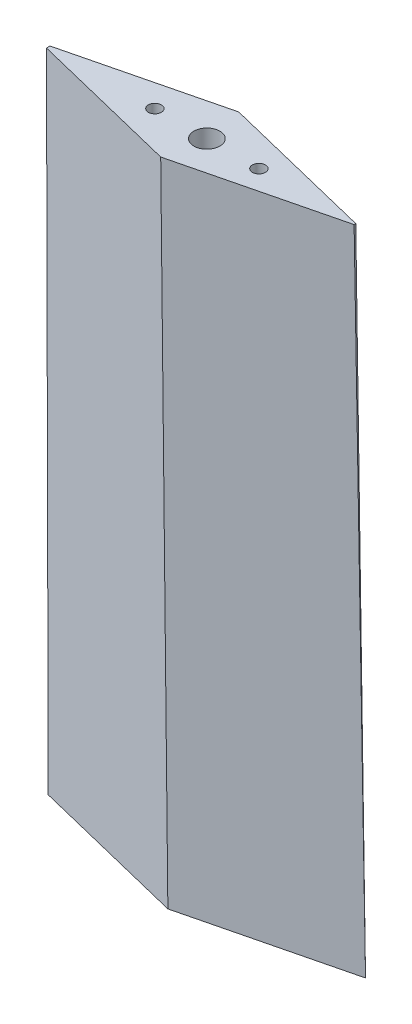
ISO-10303-21;
HEADER;
FILE_DESCRIPTION(('STEP AP214'),'2;1');
FILE_NAME('part.step','',(''),(''),'','','');
FILE_SCHEMA(('AUTOMOTIVE_DESIGN { 1 0 10303 214 1 1 1 1 }'));
ENDSEC;
DATA;
#1=APPLICATION_CONTEXT('core data for automotive mechanical design processes');
#2=APPLICATION_PROTOCOL_DEFINITION('international standard','automotive_design',2000,#1);
#3=PRODUCT_CONTEXT('',#1,'mechanical');
#4=PRODUCT('Part','Part','',(#3));
#5=PRODUCT_RELATED_PRODUCT_CATEGORY('part','',(#4));
#6=PRODUCT_DEFINITION_FORMATION('','',#4);
#7=PRODUCT_DEFINITION_CONTEXT('part definition',#1,'design');
#8=PRODUCT_DEFINITION('design','',#6,#7);
#9=PRODUCT_DEFINITION_SHAPE('','',#8);
#10=(LENGTH_UNIT() NAMED_UNIT(*) SI_UNIT(.MILLI.,.METRE.));
#11=(NAMED_UNIT(*) PLANE_ANGLE_UNIT() SI_UNIT($,.RADIAN.));
#12=(NAMED_UNIT(*) SI_UNIT($,.STERADIAN.) SOLID_ANGLE_UNIT());
#13=UNCERTAINTY_MEASURE_WITH_UNIT(LENGTH_MEASURE(1.E-05),#10,'distance_accuracy_value','');
#14=(GEOMETRIC_REPRESENTATION_CONTEXT(3) GLOBAL_UNCERTAINTY_ASSIGNED_CONTEXT((#13)) GLOBAL_UNIT_ASSIGNED_CONTEXT((#10,
#11,#12)) REPRESENTATION_CONTEXT('',''));
#15=CARTESIAN_POINT('',(0.,0.,0.));
#16=DIRECTION('',(0.,0.,1.));
#17=DIRECTION('',(1.,0.,0.));
#18=AXIS2_PLACEMENT_3D('',#15,#16,#17);
#19=CARTESIAN_POINT('',(134.681996719391,219.836565958458,-9.525));
#20=DIRECTION('',(0.999866416510167,0.0163446974617832,0.));
#21=DIRECTION('',(-0.0163446974617832,0.999866416510167,0.));
#22=AXIS2_PLACEMENT_3D('',#19,#20,#21);
#23=PLANE('',#22);
#24=DIRECTION('',(0.,0.,-1.));
#25=VECTOR('',#24,1.);
#26=CARTESIAN_POINT('',(132.097385652102,377.946914098348,-9.525));
#27=LINE('',#26,#25);
#28=CARTESIAN_POINT('',(132.097385652102,377.946914098348,0.205716307486944));
#29=VERTEX_POINT('',#28);
#30=CARTESIAN_POINT('',(132.097385652102,377.946914098348,-0.20571630748695));
#31=VERTEX_POINT('',#30);
#32=EDGE_CURVE('E49',#29,#31,#27,.T.);
#33=ORIENTED_EDGE('',*,*,#32,.F.);
#34=DIRECTION('',(-0.0163446836309879,0.999865570428571,0.00130091834944232));
#35=VECTOR('',#34,1.);
#36=CARTESIAN_POINT('',(134.682199250408,219.824176376929,-1.61200009608092E-05));
#37=LINE('',#36,#35);
#38=CARTESIAN_POINT('',(134.681996719391,219.836565958458,0.));
#39=VERTEX_POINT('',#38);
#40=EDGE_CURVE('E11',#39,#29,#37,.T.);
#41=ORIENTED_EDGE('',*,*,#40,.F.);
#42=DIRECTION('',(0.0163446836309879,-0.999865570428571,0.00130091834944232));
#43=VECTOR('',#42,1.);
#44=CARTESIAN_POINT('',(134.681794188375,219.848955539986,-1.61200009590745E-05));
#45=LINE('',#44,#43);
#46=EDGE_CURVE('E56',#31,#39,#45,.T.);
#47=ORIENTED_EDGE('',*,*,#46,.F.);
#48=EDGE_LOOP('',(#33,#41,#47));
#49=FACE_BOUND('',#48,.T.);
#50=ADVANCED_FACE('F33',(#49),#23,.T.);
#51=CARTESIAN_POINT('',(49.2246430956603,942.792954579603,0.));
#52=DIRECTION('',(0.238804060374286,0.00264025652948276,0.971064184178478));
#53=DIRECTION('',(0.971067568818316,0.,-0.238804892724763));
#54=AXIS2_PLACEMENT_3D('',#51,#52,#53);
#55=PLANE('',#54);
#56=DIRECTION('',(0.,0.999996303727557,-0.00271892096670104));
#57=VECTOR('',#56,1.);
#58=CARTESIAN_POINT('',(57.2177665065291,807.125541731836,-1.59679821194385));
#59=LINE('',#58,#57);
#60=CARTESIAN_POINT('',(57.2177665065291,219.836565958458,0.));
#61=VERTEX_POINT('',#60);
#62=CARTESIAN_POINT('',(57.2177665065291,377.946914098348,-0.429891129604688));
#63=VERTEX_POINT('',#62);
#64=EDGE_CURVE('E108',#61,#63,#59,.T.);
#65=ORIENTED_EDGE('',*,*,#64,.T.);
#66=DIRECTION('',(0.971067568818316,0.,-0.238804892724763));
#67=VECTOR('',#66,1.);
#68=CARTESIAN_POINT('',(49.5807832547215,377.946914098348,1.4481954472213));
#69=LINE('',#68,#67);
#70=CARTESIAN_POINT('',(94.2017878895919,377.946914098348,-9.52500000000005));
#71=VERTEX_POINT('',#70);
#72=EDGE_CURVE('E123',#63,#71,#69,.T.);
#73=ORIENTED_EDGE('',*,*,#72,.T.);
#74=DIRECTION('',(0.0110554869516549,-0.999938886236685,0.));
#75=VECTOR('',#74,1.);
#76=CARTESIAN_POINT('',(87.9567582020914,942.792954579603,-9.525));
#77=LINE('',#76,#75);
#78=CARTESIAN_POINT('',(95.9498816129603,219.836565958458,-9.525));
#79=VERTEX_POINT('',#78);
#80=EDGE_CURVE('E112',#71,#79,#77,.T.);
#81=ORIENTED_EDGE('',*,*,#80,.T.);
#82=DIRECTION('',(-0.971067568818316,0.,0.238804892724763));
#83=VECTOR('',#82,1.);
#84=CARTESIAN_POINT('',(57.2177665065291,219.836565958458,0.));
#85=LINE('',#84,#83);
#86=EDGE_CURVE('E116',#79,#61,#85,.T.);
#87=ORIENTED_EDGE('',*,*,#86,.T.);
#88=EDGE_LOOP('',(#65,#73,#81,#87));
#89=FACE_BOUND('',#88,.T.);
#90=ADVANCED_FACE('F172',(#89),#55,.F.);
#91=CARTESIAN_POINT('',(88.8309804853994,863.721914098348,9.525));
#92=DIRECTION('',(0.238804060374286,0.00264025652948278,-0.971064184178478));
#93=DIRECTION('',(-0.971067568818316,0.,-0.238804892724763));
#94=AXIS2_PLACEMENT_3D('',#91,#92,#93);
#95=PLANE('',#94);
#96=DIRECTION('',(0.0110554869516549,-0.999938886236685,0.));
#97=VECTOR('',#96,1.);
#98=CARTESIAN_POINT('',(88.751463048907,870.914051109623,9.525));
#99=LINE('',#98,#97);
#100=CARTESIAN_POINT('',(94.2017878895921,377.946914098348,9.52500000000001));
#101=VERTEX_POINT('',#100);
#102=CARTESIAN_POINT('',(95.9498816129603,219.836565958458,9.525));
#103=VERTEX_POINT('',#102);
#104=EDGE_CURVE('E42',#101,#103,#99,.T.);
#105=ORIENTED_EDGE('',*,*,#104,.F.);
#106=DIRECTION('',(-0.971067568818316,0.,-0.238804892724763));
#107=VECTOR('',#106,1.);
#108=CARTESIAN_POINT('',(89.1372656912239,377.946914098348,8.27953292940755));
#109=LINE('',#108,#107);
#110=CARTESIAN_POINT('',(57.2177665065291,377.946914098348,0.429891129604686));
#111=VERTEX_POINT('',#110);
#112=EDGE_CURVE('E80',#101,#111,#109,.T.);
#113=ORIENTED_EDGE('',*,*,#112,.T.);
#114=DIRECTION('',(0.,-0.999996303727557,-0.00271892096670106));
#115=VECTOR('',#114,1.);
#116=CARTESIAN_POINT('',(57.2177665065291,807.073746478871,1.59665738422406));
#117=LINE('',#116,#115);
#118=EDGE_CURVE('E103',#111,#61,#117,.T.);
#119=ORIENTED_EDGE('',*,*,#118,.T.);
#120=DIRECTION('',(0.971067568818316,0.,0.238804892724763));
#121=VECTOR('',#120,1.);
#122=CARTESIAN_POINT('',(95.9498816129603,219.836565958458,9.525));
#123=LINE('',#122,#121);
#124=EDGE_CURVE('E99',#61,#103,#123,.T.);
#125=ORIENTED_EDGE('',*,*,#124,.T.);
#126=EDGE_LOOP('',(#105,#113,#119,#125));
#127=FACE_BOUND('',#126,.T.);
#128=ADVANCED_FACE('F97',(#127),#95,.F.);
#129=CARTESIAN_POINT('',(57.2177665065291,807.103985498089,-9.525));
#130=DIRECTION('',(-1.,0.,0.));
#131=DIRECTION('',(0.,0.,1.));
#132=AXIS2_PLACEMENT_3D('',#129,#130,#131);
#133=PLANE('',#132);
#134=DIRECTION('',(0.,0.,1.));
#135=VECTOR('',#134,1.);
#136=CARTESIAN_POINT('',(57.2177665065291,377.946914098348,-9.525));
#137=LINE('',#136,#135);
#138=EDGE_CURVE('E85',#63,#111,#137,.T.);
#139=ORIENTED_EDGE('',*,*,#138,.F.);
#140=ORIENTED_EDGE('',*,*,#64,.F.);
#141=ORIENTED_EDGE('',*,*,#118,.F.);
#142=EDGE_LOOP('',(#139,#140,#141));
#143=FACE_BOUND('',#142,.T.);
#144=ADVANCED_FACE('F35',(#143),#133,.T.);
#145=CARTESIAN_POINT('',(57.2177665065291,219.836565958458,-9.525));
#146=DIRECTION('',(0.,-1.,0.));
#147=DIRECTION('',(0.,0.,-1.));
#148=AXIS2_PLACEMENT_3D('',#145,#146,#147);
#149=PLANE('',#148);
#150=CARTESIAN_POINT('',(108.64988161296,219.836565958458,0.));
#151=DIRECTION('',(0.,-1.,0.));
#152=DIRECTION('',(0.,0.,-1.));
#153=AXIS2_PLACEMENT_3D('',#150,#151,#152);
#154=CIRCLE('',#153,1.5875);
#155=CARTESIAN_POINT('',(108.64988161296,219.836565958458,-1.5875));
#156=VERTEX_POINT('',#155);
#157=EDGE_CURVE('E147',#156,#156,#154,.T.);
#158=ORIENTED_EDGE('',*,*,#157,.F.);
#159=EDGE_LOOP('',(#158));
#160=FACE_BOUND('',#159,.T.);
#161=CARTESIAN_POINT('',(83.2498816129603,219.836565958458,0.));
#162=DIRECTION('',(0.,-1.,0.));
#163=DIRECTION('',(0.,0.,-1.));
#164=AXIS2_PLACEMENT_3D('',#161,#162,#163);
#165=CIRCLE('',#164,1.5875);
#166=CARTESIAN_POINT('',(83.2498816129603,219.836565958458,-1.5875));
#167=VERTEX_POINT('',#166);
#168=EDGE_CURVE('E141',#167,#167,#165,.T.);
#169=ORIENTED_EDGE('',*,*,#168,.F.);
#170=EDGE_LOOP('',(#169));
#171=FACE_BOUND('',#170,.T.);
#172=CARTESIAN_POINT('',(95.9498816129603,219.836565958458,0.));
#173=DIRECTION('',(0.,-1.,0.));
#174=DIRECTION('',(0.,0.,-1.));
#175=AXIS2_PLACEMENT_3D('',#172,#173,#174);
#176=CIRCLE('',#175,3.175);
#177=CARTESIAN_POINT('',(95.9498816129603,219.836565958458,-3.175));
#178=VERTEX_POINT('',#177);
#179=EDGE_CURVE('E89',#178,#178,#176,.T.);
#180=ORIENTED_EDGE('',*,*,#179,.F.);
#181=EDGE_LOOP('',(#180));
#182=FACE_BOUND('',#181,.T.);
#183=ORIENTED_EDGE('',*,*,#86,.F.);
#184=DIRECTION('',(-0.971067568818316,0.,-0.238804892724763));
#185=VECTOR('',#184,1.);
#186=CARTESIAN_POINT('',(95.9498816129603,219.836565958458,-9.525));
#187=LINE('',#186,#185);
#188=EDGE_CURVE('E114',#39,#79,#187,.T.);
#189=ORIENTED_EDGE('',*,*,#188,.F.);
#190=DIRECTION('',(0.971067568818316,0.,-0.238804892724763));
#191=VECTOR('',#190,1.);
#192=CARTESIAN_POINT('',(95.9498816129603,219.836565958458,9.525));
#193=LINE('',#192,#191);
#194=EDGE_CURVE('E101',#103,#39,#193,.T.);
#195=ORIENTED_EDGE('',*,*,#194,.F.);
#196=ORIENTED_EDGE('',*,*,#124,.F.);
#197=EDGE_LOOP('',(#183,#189,#195,#196));
#198=FACE_BOUND('',#197,.T.);
#199=ADVANCED_FACE('F162',(#160,#171,#182,#198),#149,.T.);
#200=CARTESIAN_POINT('',(88.751463048907,870.914051109623,9.525));
#201=DIRECTION('',(-0.238804060374287,-0.00264025652948276,-0.971064184178478));
#202=DIRECTION('',(-0.971067568818316,0.,0.238804892724763));
#203=AXIS2_PLACEMENT_3D('',#200,#201,#202);
#204=PLANE('',#203);
#205=ORIENTED_EDGE('',*,*,#40,.T.);
#206=DIRECTION('',(-0.971067568818316,0.,0.238804892724763));
#207=VECTOR('',#206,1.);
#208=CARTESIAN_POINT('',(89.0622829573506,377.946914098348,10.7889068211245));
#209=LINE('',#208,#207);
#210=EDGE_CURVE('E83',#29,#101,#209,.T.);
#211=ORIENTED_EDGE('',*,*,#210,.T.);
#212=ORIENTED_EDGE('',*,*,#104,.T.);
#213=ORIENTED_EDGE('',*,*,#194,.T.);
#214=EDGE_LOOP('',(#205,#211,#212,#213));
#215=FACE_BOUND('',#214,.T.);
#216=ADVANCED_FACE('F92',(#215),#204,.F.);
#217=CARTESIAN_POINT('',(87.9567582020914,942.792954579603,-9.525));
#218=DIRECTION('',(-0.238804060374286,-0.00264025652948276,0.971064184178478));
#219=DIRECTION('',(0.971067568818316,0.,0.238804892724763));
#220=AXIS2_PLACEMENT_3D('',#217,#218,#219);
#221=PLANE('',#220);
#222=ORIENTED_EDGE('',*,*,#80,.F.);
#223=DIRECTION('',(0.971067568818316,0.,0.238804892724763));
#224=VECTOR('',#223,1.);
#225=CARTESIAN_POINT('',(88.3128983611527,377.946914098348,-10.9731954472213));
#226=LINE('',#225,#224);
#227=EDGE_CURVE('E126',#71,#31,#226,.T.);
#228=ORIENTED_EDGE('',*,*,#227,.T.);
#229=ORIENTED_EDGE('',*,*,#46,.T.);
#230=ORIENTED_EDGE('',*,*,#188,.T.);
#231=EDGE_LOOP('',(#222,#228,#229,#230));
#232=FACE_BOUND('',#231,.T.);
#233=ADVANCED_FACE('F189',(#232),#221,.F.);
#234=CARTESIAN_POINT('',(95.9498816129603,778.636565958458,0.));
#235=DIRECTION('',(0.,-1.,0.));
#236=DIRECTION('',(0.,0.,-1.));
#237=AXIS2_PLACEMENT_3D('',#234,#235,#236);
#238=CYLINDRICAL_SURFACE('',#237,3.175);
#239=CARTESIAN_POINT('',(95.9498816129603,377.946914098348,0.));
#240=DIRECTION('',(0.,-1.,0.));
#241=DIRECTION('',(0.,0.,-1.));
#242=AXIS2_PLACEMENT_3D('',#239,#240,#241);
#243=CIRCLE('',#242,3.175);
#244=CARTESIAN_POINT('',(95.9498816129603,377.946914098348,-3.175));
#245=VERTEX_POINT('',#244);
#246=EDGE_CURVE('E37',#245,#245,#243,.F.);
#247=ORIENTED_EDGE('',*,*,#246,.T.);
#248=EDGE_LOOP('',(#247));
#249=FACE_BOUND('',#248,.T.);
#250=ORIENTED_EDGE('',*,*,#179,.T.);
#251=EDGE_LOOP('',(#250));
#252=FACE_BOUND('',#251,.T.);
#253=ADVANCED_FACE('F193',(#249,#252),#238,.F.);
#254=CARTESIAN_POINT('',(0.,377.946914098348,-9.52500000000005));
#255=DIRECTION('',(0.,-1.,0.));
#256=DIRECTION('',(0.,0.,-1.));
#257=AXIS2_PLACEMENT_3D('',#254,#255,#256);
#258=PLANE('',#257);
#259=CARTESIAN_POINT('',(108.64988161296,377.946914098348,0.));
#260=DIRECTION('',(0.,1.,0.));
#261=DIRECTION('',(0.,0.,1.));
#262=AXIS2_PLACEMENT_3D('',#259,#260,#261);
#263=CIRCLE('',#262,1.5875);
#264=CARTESIAN_POINT('',(108.64988161296,377.946914098348,1.5875));
#265=VERTEX_POINT('',#264);
#266=EDGE_CURVE('E135',#265,#265,#263,.T.);
#267=ORIENTED_EDGE('',*,*,#266,.F.);
#268=EDGE_LOOP('',(#267));
#269=FACE_BOUND('',#268,.T.);
#270=CARTESIAN_POINT('',(83.2498816129603,377.946914098348,0.));
#271=DIRECTION('',(0.,1.,0.));
#272=DIRECTION('',(0.,0.,1.));
#273=AXIS2_PLACEMENT_3D('',#270,#271,#272);
#274=CIRCLE('',#273,1.5875);
#275=CARTESIAN_POINT('',(83.2498816129603,377.946914098348,1.5875));
#276=VERTEX_POINT('',#275);
#277=EDGE_CURVE('E128',#276,#276,#274,.T.);
#278=ORIENTED_EDGE('',*,*,#277,.F.);
#279=EDGE_LOOP('',(#278));
#280=FACE_BOUND('',#279,.T.);
#281=ORIENTED_EDGE('',*,*,#246,.F.);
#282=EDGE_LOOP('',(#281));
#283=FACE_BOUND('',#282,.T.);
#284=ORIENTED_EDGE('',*,*,#210,.F.);
#285=ORIENTED_EDGE('',*,*,#32,.T.);
#286=ORIENTED_EDGE('',*,*,#227,.F.);
#287=ORIENTED_EDGE('',*,*,#72,.F.);
#288=ORIENTED_EDGE('',*,*,#138,.T.);
#289=ORIENTED_EDGE('',*,*,#112,.F.);
#290=EDGE_LOOP('',(#284,#285,#286,#287,#288,#289));
#291=FACE_BOUND('',#290,.T.);
#292=ADVANCED_FACE('F82',(#269,#280,#283,#291),#258,.F.);
#293=CARTESIAN_POINT('',(83.2498816129603,365.246914098348,0.));
#294=DIRECTION('',(0.,1.,0.));
#295=DIRECTION('',(0.,0.,1.));
#296=AXIS2_PLACEMENT_3D('',#293,#294,#295);
#297=CYLINDRICAL_SURFACE('',#296,1.5875);
#298=CARTESIAN_POINT('',(83.2498816129603,365.246914098348,0.));
#299=DIRECTION('',(0.,1.,0.));
#300=DIRECTION('',(0.,0.,1.));
#301=AXIS2_PLACEMENT_3D('',#298,#299,#300);
#302=CIRCLE('',#301,1.5875);
#303=CARTESIAN_POINT('',(83.2498816129603,365.246914098348,1.5875));
#304=VERTEX_POINT('',#303);
#305=EDGE_CURVE('E131',#304,#304,#302,.T.);
#306=ORIENTED_EDGE('',*,*,#305,.F.);
#307=EDGE_LOOP('',(#306));
#308=FACE_BOUND('',#307,.T.);
#309=ORIENTED_EDGE('',*,*,#277,.T.);
#310=EDGE_LOOP('',(#309));
#311=FACE_BOUND('',#310,.T.);
#312=ADVANCED_FACE('F199',(#308,#311),#297,.F.);
#313=CARTESIAN_POINT('',(83.2498816129603,365.246914098348,0.));
#314=DIRECTION('',(0.,1.,0.));
#315=DIRECTION('',(0.,0.,1.));
#316=AXIS2_PLACEMENT_3D('',#313,#314,#315);
#317=PLANE('',#316);
#318=ORIENTED_EDGE('',*,*,#305,.T.);
#319=EDGE_LOOP('',(#318));
#320=FACE_BOUND('',#319,.T.);
#321=ADVANCED_FACE('F203',(#320),#317,.T.);
#322=CARTESIAN_POINT('',(108.64988161296,365.246914098348,0.));
#323=DIRECTION('',(0.,1.,0.));
#324=DIRECTION('',(0.,0.,1.));
#325=AXIS2_PLACEMENT_3D('',#322,#323,#324);
#326=CYLINDRICAL_SURFACE('',#325,1.5875);
#327=CARTESIAN_POINT('',(108.64988161296,365.246914098348,0.));
#328=DIRECTION('',(0.,1.,0.));
#329=DIRECTION('',(0.,0.,1.));
#330=AXIS2_PLACEMENT_3D('',#327,#328,#329);
#331=CIRCLE('',#330,1.5875);
#332=CARTESIAN_POINT('',(108.64988161296,365.246914098348,1.5875));
#333=VERTEX_POINT('',#332);
#334=EDGE_CURVE('E132',#333,#333,#331,.T.);
#335=ORIENTED_EDGE('',*,*,#334,.F.);
#336=EDGE_LOOP('',(#335));
#337=FACE_BOUND('',#336,.T.);
#338=ORIENTED_EDGE('',*,*,#266,.T.);
#339=EDGE_LOOP('',(#338));
#340=FACE_BOUND('',#339,.T.);
#341=ADVANCED_FACE('F207',(#337,#340),#326,.F.);
#342=CARTESIAN_POINT('',(108.64988161296,365.246914098348,0.));
#343=DIRECTION('',(0.,1.,0.));
#344=DIRECTION('',(0.,0.,1.));
#345=AXIS2_PLACEMENT_3D('',#342,#343,#344);
#346=PLANE('',#345);
#347=ORIENTED_EDGE('',*,*,#334,.T.);
#348=EDGE_LOOP('',(#347));
#349=FACE_BOUND('',#348,.T.);
#350=ADVANCED_FACE('F211',(#349),#346,.T.);
#351=CARTESIAN_POINT('',(83.2498816129603,232.536565958458,0.));
#352=DIRECTION('',(0.,-1.,0.));
#353=DIRECTION('',(0.,0.,-1.));
#354=AXIS2_PLACEMENT_3D('',#351,#352,#353);
#355=CYLINDRICAL_SURFACE('',#354,1.5875);
#356=CARTESIAN_POINT('',(83.2498816129603,232.536565958458,0.));
#357=DIRECTION('',(0.,-1.,0.));
#358=DIRECTION('',(0.,0.,-1.));
#359=AXIS2_PLACEMENT_3D('',#356,#357,#358);
#360=CIRCLE('',#359,1.5875);
#361=CARTESIAN_POINT('',(83.2498816129603,232.536565958458,-1.5875));
#362=VERTEX_POINT('',#361);
#363=EDGE_CURVE('E138',#362,#362,#360,.T.);
#364=ORIENTED_EDGE('',*,*,#363,.F.);
#365=EDGE_LOOP('',(#364));
#366=FACE_BOUND('',#365,.T.);
#367=ORIENTED_EDGE('',*,*,#168,.T.);
#368=EDGE_LOOP('',(#367));
#369=FACE_BOUND('',#368,.T.);
#370=ADVANCED_FACE('F215',(#366,#369),#355,.F.);
#371=CARTESIAN_POINT('',(83.2498816129603,232.536565958458,0.));
#372=DIRECTION('',(0.,-1.,0.));
#373=DIRECTION('',(0.,0.,-1.));
#374=AXIS2_PLACEMENT_3D('',#371,#372,#373);
#375=PLANE('',#374);
#376=ORIENTED_EDGE('',*,*,#363,.T.);
#377=EDGE_LOOP('',(#376));
#378=FACE_BOUND('',#377,.T.);
#379=ADVANCED_FACE('F158',(#378),#375,.T.);
#380=CARTESIAN_POINT('',(108.64988161296,232.536565958458,0.));
#381=DIRECTION('',(0.,-1.,0.));
#382=DIRECTION('',(0.,0.,-1.));
#383=AXIS2_PLACEMENT_3D('',#380,#381,#382);
#384=CYLINDRICAL_SURFACE('',#383,1.5875);
#385=CARTESIAN_POINT('',(108.64988161296,232.536565958458,0.));
#386=DIRECTION('',(0.,-1.,0.));
#387=DIRECTION('',(0.,0.,-1.));
#388=AXIS2_PLACEMENT_3D('',#385,#386,#387);
#389=CIRCLE('',#388,1.5875);
#390=CARTESIAN_POINT('',(108.64988161296,232.536565958458,-1.5875));
#391=VERTEX_POINT('',#390);
#392=EDGE_CURVE('E144',#391,#391,#389,.T.);
#393=ORIENTED_EDGE('',*,*,#392,.F.);
#394=EDGE_LOOP('',(#393));
#395=FACE_BOUND('',#394,.T.);
#396=ORIENTED_EDGE('',*,*,#157,.T.);
#397=EDGE_LOOP('',(#396));
#398=FACE_BOUND('',#397,.T.);
#399=ADVANCED_FACE('F155',(#395,#398),#384,.F.);
#400=CARTESIAN_POINT('',(108.64988161296,232.536565958458,0.));
#401=DIRECTION('',(0.,-1.,0.));
#402=DIRECTION('',(0.,0.,-1.));
#403=AXIS2_PLACEMENT_3D('',#400,#401,#402);
#404=PLANE('',#403);
#405=ORIENTED_EDGE('',*,*,#392,.T.);
#406=EDGE_LOOP('',(#405));
#407=FACE_BOUND('',#406,.T.);
#408=ADVANCED_FACE('F153',(#407),#404,.T.);
#409=CLOSED_SHELL('',(#50,#90,#128,#144,#199,#216,#233,#253,#292,#312,#321,#341,#350,#370,#379,
#399,#408));
#410=MANIFOLD_SOLID_BREP('B2',#409);
#411=ADVANCED_BREP_SHAPE_REPRESENTATION('',(#18,#410),#14);
#412=SHAPE_DEFINITION_REPRESENTATION(#9,#411);
ENDSEC;
END-ISO-10303-21;
